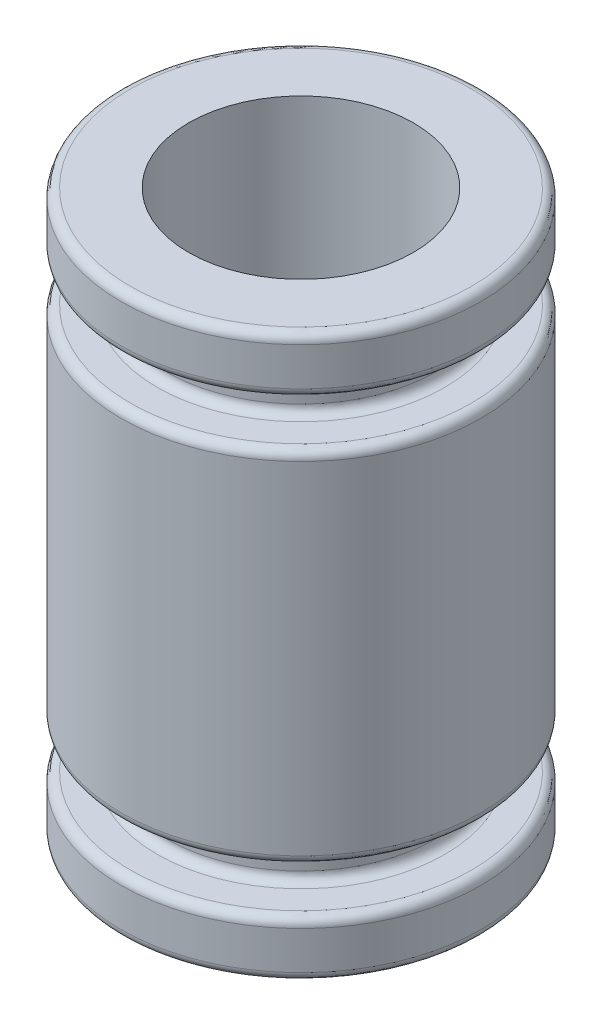
ISO-10303-21;
HEADER;
FILE_DESCRIPTION(('STEP AP214'),'2;1');
FILE_NAME('part.step','',(''),(''),'','','');
FILE_SCHEMA(('AUTOMOTIVE_DESIGN { 1 0 10303 214 1 1 1 1 }'));
ENDSEC;
DATA;
#1=APPLICATION_CONTEXT('core data for automotive mechanical design processes');
#2=APPLICATION_PROTOCOL_DEFINITION('international standard','automotive_design',2000,#1);
#3=PRODUCT_CONTEXT('',#1,'mechanical');
#4=PRODUCT('Part','Part','',(#3));
#5=PRODUCT_RELATED_PRODUCT_CATEGORY('part','',(#4));
#6=PRODUCT_DEFINITION_FORMATION('','',#4);
#7=PRODUCT_DEFINITION_CONTEXT('part definition',#1,'design');
#8=PRODUCT_DEFINITION('design','',#6,#7);
#9=PRODUCT_DEFINITION_SHAPE('','',#8);
#10=(LENGTH_UNIT() NAMED_UNIT(*) SI_UNIT(.MILLI.,.METRE.));
#11=(NAMED_UNIT(*) PLANE_ANGLE_UNIT() SI_UNIT($,.RADIAN.));
#12=(NAMED_UNIT(*) SI_UNIT($,.STERADIAN.) SOLID_ANGLE_UNIT());
#13=UNCERTAINTY_MEASURE_WITH_UNIT(LENGTH_MEASURE(1.E-05),#10,'distance_accuracy_value','');
#14=(GEOMETRIC_REPRESENTATION_CONTEXT(3) GLOBAL_UNCERTAINTY_ASSIGNED_CONTEXT((#13)) GLOBAL_UNIT_ASSIGNED_CONTEXT((#10,
#11,#12)) REPRESENTATION_CONTEXT('',''));
#15=CARTESIAN_POINT('',(0.,0.,0.));
#16=DIRECTION('',(0.,0.,1.));
#17=DIRECTION('',(1.,0.,0.));
#18=AXIS2_PLACEMENT_3D('',#15,#16,#17);
#19=CARTESIAN_POINT('',(0.,6.25,0.));
#20=DIRECTION('',(0.,-1.,0.));
#21=DIRECTION('',(1.,0.,0.));
#22=AXIS2_PLACEMENT_3D('',#19,#20,#21);
#23=PLANE('',#22);
#24=CARTESIAN_POINT('',(0.,6.25,0.));
#25=DIRECTION('',(0.,1.,0.));
#26=DIRECTION('',(-1.,0.,0.));
#27=AXIS2_PLACEMENT_3D('',#24,#25,#26);
#28=CIRCLE('',#27,2.5);
#29=CARTESIAN_POINT('',(-2.5,6.25,0.));
#30=VERTEX_POINT('',#29);
#31=EDGE_CURVE('E99',#30,#30,#28,.T.);
#32=ORIENTED_EDGE('',*,*,#31,.F.);
#33=EDGE_LOOP('',(#32));
#34=FACE_BOUND('',#33,.T.);
#35=CARTESIAN_POINT('',(0.,6.25,0.));
#36=DIRECTION('',(0.,-1.,0.));
#37=DIRECTION('',(1.,0.,0.));
#38=AXIS2_PLACEMENT_3D('',#35,#36,#37);
#39=CIRCLE('',#38,3.8);
#40=CARTESIAN_POINT('',(3.8,6.25,0.));
#41=VERTEX_POINT('',#40);
#42=EDGE_CURVE('E10',#41,#41,#39,.F.);
#43=ORIENTED_EDGE('',*,*,#42,.T.);
#44=EDGE_LOOP('',(#43));
#45=FACE_BOUND('',#44,.T.);
#46=ADVANCED_FACE('F30',(#34,#45),#23,.F.);
#47=CARTESIAN_POINT('',(0.,-6.25,0.));
#48=DIRECTION('',(0.,-1.,0.));
#49=DIRECTION('',(1.,0.,0.));
#50=AXIS2_PLACEMENT_3D('',#47,#48,#49);
#51=CYLINDRICAL_SURFACE('',#50,4.);
#52=CARTESIAN_POINT('',(0.,5.2,0.));
#53=DIRECTION('',(0.,1.,0.));
#54=DIRECTION('',(-1.,0.,0.));
#55=AXIS2_PLACEMENT_3D('',#52,#53,#54);
#56=CIRCLE('',#55,4.);
#57=CARTESIAN_POINT('',(-4.,5.2,0.));
#58=VERTEX_POINT('',#57);
#59=EDGE_CURVE('E37',#58,#58,#56,.T.);
#60=ORIENTED_EDGE('',*,*,#59,.T.);
#61=EDGE_LOOP('',(#60));
#62=FACE_BOUND('',#61,.T.);
#63=CARTESIAN_POINT('',(0.,6.05,0.));
#64=DIRECTION('',(0.,-1.,0.));
#65=DIRECTION('',(1.,0.,0.));
#66=AXIS2_PLACEMENT_3D('',#63,#64,#65);
#67=CIRCLE('',#66,4.);
#68=CARTESIAN_POINT('',(4.,6.05,0.));
#69=VERTEX_POINT('',#68);
#70=EDGE_CURVE('E41',#69,#69,#67,.T.);
#71=ORIENTED_EDGE('',*,*,#70,.T.);
#72=EDGE_LOOP('',(#71));
#73=FACE_BOUND('',#72,.T.);
#74=ADVANCED_FACE('F115',(#62,#73),#51,.T.);
#75=CARTESIAN_POINT('',(-4.,5.,0.));
#76=DIRECTION('',(0.,1.,0.));
#77=DIRECTION('',(-1.,0.,0.));
#78=AXIS2_PLACEMENT_3D('',#75,#76,#77);
#79=PLANE('',#78);
#80=CARTESIAN_POINT('',(0.,5.,0.));
#81=DIRECTION('',(0.,1.,0.));
#82=DIRECTION('',(-1.,0.,0.));
#83=AXIS2_PLACEMENT_3D('',#80,#81,#82);
#84=CIRCLE('',#83,3.2);
#85=CARTESIAN_POINT('',(-3.2,5.,0.));
#86=VERTEX_POINT('',#85);
#87=EDGE_CURVE('E53',#86,#86,#84,.T.);
#88=ORIENTED_EDGE('',*,*,#87,.T.);
#89=EDGE_LOOP('',(#88));
#90=FACE_BOUND('',#89,.T.);
#91=CARTESIAN_POINT('',(0.,5.,0.));
#92=DIRECTION('',(0.,1.,0.));
#93=DIRECTION('',(-1.,0.,0.));
#94=AXIS2_PLACEMENT_3D('',#91,#92,#93);
#95=CIRCLE('',#94,3.8);
#96=CARTESIAN_POINT('',(-3.8,5.,0.));
#97=VERTEX_POINT('',#96);
#98=EDGE_CURVE('E56',#97,#97,#95,.F.);
#99=ORIENTED_EDGE('',*,*,#98,.T.);
#100=EDGE_LOOP('',(#99));
#101=FACE_BOUND('',#100,.T.);
#102=ADVANCED_FACE('F120',(#90,#101),#79,.F.);
#103=CARTESIAN_POINT('',(0.,-6.25,0.));
#104=DIRECTION('',(0.,-1.,0.));
#105=DIRECTION('',(1.,0.,0.));
#106=AXIS2_PLACEMENT_3D('',#103,#104,#105);
#107=CYLINDRICAL_SURFACE('',#106,3.);
#108=CARTESIAN_POINT('',(0.,4.8,0.));
#109=DIRECTION('',(0.,1.,0.));
#110=DIRECTION('',(-1.,0.,0.));
#111=AXIS2_PLACEMENT_3D('',#108,#109,#110);
#112=CIRCLE('',#111,3.);
#113=CARTESIAN_POINT('',(-3.,4.8,0.));
#114=VERTEX_POINT('',#113);
#115=EDGE_CURVE('E59',#114,#114,#112,.F.);
#116=ORIENTED_EDGE('',*,*,#115,.T.);
#117=EDGE_LOOP('',(#116));
#118=FACE_BOUND('',#117,.T.);
#119=CARTESIAN_POINT('',(0.,4.2,0.));
#120=DIRECTION('',(0.,-1.,0.));
#121=DIRECTION('',(1.,0.,0.));
#122=AXIS2_PLACEMENT_3D('',#119,#120,#121);
#123=CIRCLE('',#122,3.);
#124=CARTESIAN_POINT('',(3.,4.2,0.));
#125=VERTEX_POINT('',#124);
#126=EDGE_CURVE('E62',#125,#125,#123,.F.);
#127=ORIENTED_EDGE('',*,*,#126,.T.);
#128=EDGE_LOOP('',(#127));
#129=FACE_BOUND('',#128,.T.);
#130=ADVANCED_FACE('F166',(#118,#129),#107,.T.);
#131=CARTESIAN_POINT('',(-3.,4.,0.));
#132=DIRECTION('',(0.,-1.,0.));
#133=DIRECTION('',(1.,0.,0.));
#134=AXIS2_PLACEMENT_3D('',#131,#132,#133);
#135=PLANE('',#134);
#136=CARTESIAN_POINT('',(0.,4.,0.));
#137=DIRECTION('',(0.,-1.,0.));
#138=DIRECTION('',(1.,0.,0.));
#139=AXIS2_PLACEMENT_3D('',#136,#137,#138);
#140=CIRCLE('',#139,3.2);
#141=CARTESIAN_POINT('',(3.2,4.,0.));
#142=VERTEX_POINT('',#141);
#143=EDGE_CURVE('E45',#142,#142,#140,.T.);
#144=ORIENTED_EDGE('',*,*,#143,.T.);
#145=EDGE_LOOP('',(#144));
#146=FACE_BOUND('',#145,.T.);
#147=CARTESIAN_POINT('',(0.,4.,0.));
#148=DIRECTION('',(0.,-1.,0.));
#149=DIRECTION('',(1.,0.,0.));
#150=AXIS2_PLACEMENT_3D('',#147,#148,#149);
#151=CIRCLE('',#150,3.8);
#152=CARTESIAN_POINT('',(3.8,4.,0.));
#153=VERTEX_POINT('',#152);
#154=EDGE_CURVE('E50',#153,#153,#151,.F.);
#155=ORIENTED_EDGE('',*,*,#154,.T.);
#156=EDGE_LOOP('',(#155));
#157=FACE_BOUND('',#156,.T.);
#158=ADVANCED_FACE('F171',(#146,#157),#135,.F.);
#159=CARTESIAN_POINT('',(0.,-6.25,0.));
#160=DIRECTION('',(0.,-1.,0.));
#161=DIRECTION('',(1.,0.,0.));
#162=AXIS2_PLACEMENT_3D('',#159,#160,#161);
#163=CYLINDRICAL_SURFACE('',#162,4.);
#164=CARTESIAN_POINT('',(0.,-3.8,0.));
#165=DIRECTION('',(0.,1.,0.));
#166=DIRECTION('',(-1.,0.,0.));
#167=AXIS2_PLACEMENT_3D('',#164,#165,#166);
#168=CIRCLE('',#167,4.);
#169=CARTESIAN_POINT('',(-4.,-3.8,0.));
#170=VERTEX_POINT('',#169);
#171=EDGE_CURVE('E65',#170,#170,#168,.T.);
#172=ORIENTED_EDGE('',*,*,#171,.T.);
#173=EDGE_LOOP('',(#172));
#174=FACE_BOUND('',#173,.T.);
#175=CARTESIAN_POINT('',(0.,3.8,0.));
#176=DIRECTION('',(0.,-1.,0.));
#177=DIRECTION('',(1.,0.,0.));
#178=AXIS2_PLACEMENT_3D('',#175,#176,#177);
#179=CIRCLE('',#178,4.);
#180=CARTESIAN_POINT('',(4.,3.8,0.));
#181=VERTEX_POINT('',#180);
#182=EDGE_CURVE('E68',#181,#181,#179,.T.);
#183=ORIENTED_EDGE('',*,*,#182,.T.);
#184=EDGE_LOOP('',(#183));
#185=FACE_BOUND('',#184,.T.);
#186=ADVANCED_FACE('F177',(#174,#185),#163,.T.);
#187=CARTESIAN_POINT('',(-3.,-4.,0.));
#188=DIRECTION('',(0.,1.,0.));
#189=DIRECTION('',(-1.,0.,0.));
#190=AXIS2_PLACEMENT_3D('',#187,#188,#189);
#191=PLANE('',#190);
#192=CARTESIAN_POINT('',(0.,-4.,0.));
#193=DIRECTION('',(0.,1.,0.));
#194=DIRECTION('',(-1.,0.,0.));
#195=AXIS2_PLACEMENT_3D('',#192,#193,#194);
#196=CIRCLE('',#195,3.2);
#197=CARTESIAN_POINT('',(-3.2,-4.,0.));
#198=VERTEX_POINT('',#197);
#199=EDGE_CURVE('E86',#198,#198,#196,.T.);
#200=ORIENTED_EDGE('',*,*,#199,.T.);
#201=EDGE_LOOP('',(#200));
#202=FACE_BOUND('',#201,.T.);
#203=CARTESIAN_POINT('',(0.,-4.,0.));
#204=DIRECTION('',(0.,1.,0.));
#205=DIRECTION('',(-1.,0.,0.));
#206=AXIS2_PLACEMENT_3D('',#203,#204,#205);
#207=CIRCLE('',#206,3.8);
#208=CARTESIAN_POINT('',(-3.8,-4.,0.));
#209=VERTEX_POINT('',#208);
#210=EDGE_CURVE('E89',#209,#209,#207,.F.);
#211=ORIENTED_EDGE('',*,*,#210,.T.);
#212=EDGE_LOOP('',(#211));
#213=FACE_BOUND('',#212,.T.);
#214=ADVANCED_FACE('F181',(#202,#213),#191,.F.);
#215=CARTESIAN_POINT('',(0.,-6.25,0.));
#216=DIRECTION('',(0.,-1.,0.));
#217=DIRECTION('',(1.,0.,0.));
#218=AXIS2_PLACEMENT_3D('',#215,#216,#217);
#219=CYLINDRICAL_SURFACE('',#218,3.);
#220=CARTESIAN_POINT('',(0.,-4.2,0.));
#221=DIRECTION('',(0.,1.,0.));
#222=DIRECTION('',(-1.,0.,0.));
#223=AXIS2_PLACEMENT_3D('',#220,#221,#222);
#224=CIRCLE('',#223,3.);
#225=CARTESIAN_POINT('',(-3.,-4.2,0.));
#226=VERTEX_POINT('',#225);
#227=EDGE_CURVE('E92',#226,#226,#224,.F.);
#228=ORIENTED_EDGE('',*,*,#227,.T.);
#229=EDGE_LOOP('',(#228));
#230=FACE_BOUND('',#229,.T.);
#231=CARTESIAN_POINT('',(0.,-4.8,0.));
#232=DIRECTION('',(0.,-1.,0.));
#233=DIRECTION('',(1.,0.,0.));
#234=AXIS2_PLACEMENT_3D('',#231,#232,#233);
#235=CIRCLE('',#234,3.);
#236=CARTESIAN_POINT('',(3.,-4.8,0.));
#237=VERTEX_POINT('',#236);
#238=EDGE_CURVE('E95',#237,#237,#235,.F.);
#239=ORIENTED_EDGE('',*,*,#238,.T.);
#240=EDGE_LOOP('',(#239));
#241=FACE_BOUND('',#240,.T.);
#242=ADVANCED_FACE('F185',(#230,#241),#219,.T.);
#243=CARTESIAN_POINT('',(-4.,-5.,0.));
#244=DIRECTION('',(0.,-1.,0.));
#245=DIRECTION('',(1.,0.,0.));
#246=AXIS2_PLACEMENT_3D('',#243,#244,#245);
#247=PLANE('',#246);
#248=CARTESIAN_POINT('',(0.,-5.,0.));
#249=DIRECTION('',(0.,-1.,0.));
#250=DIRECTION('',(1.,0.,0.));
#251=AXIS2_PLACEMENT_3D('',#248,#249,#250);
#252=CIRCLE('',#251,3.2);
#253=CARTESIAN_POINT('',(3.2,-5.,0.));
#254=VERTEX_POINT('',#253);
#255=EDGE_CURVE('E80',#254,#254,#252,.T.);
#256=ORIENTED_EDGE('',*,*,#255,.T.);
#257=EDGE_LOOP('',(#256));
#258=FACE_BOUND('',#257,.T.);
#259=CARTESIAN_POINT('',(0.,-5.,0.));
#260=DIRECTION('',(0.,-1.,0.));
#261=DIRECTION('',(1.,0.,0.));
#262=AXIS2_PLACEMENT_3D('',#259,#260,#261);
#263=CIRCLE('',#262,3.8);
#264=CARTESIAN_POINT('',(3.8,-5.,0.));
#265=VERTEX_POINT('',#264);
#266=EDGE_CURVE('E83',#265,#265,#263,.F.);
#267=ORIENTED_EDGE('',*,*,#266,.T.);
#268=EDGE_LOOP('',(#267));
#269=FACE_BOUND('',#268,.T.);
#270=ADVANCED_FACE('F189',(#258,#269),#247,.F.);
#271=CARTESIAN_POINT('',(0.,-6.25,0.));
#272=DIRECTION('',(0.,-1.,0.));
#273=DIRECTION('',(1.,0.,0.));
#274=AXIS2_PLACEMENT_3D('',#271,#272,#273);
#275=CYLINDRICAL_SURFACE('',#274,4.);
#276=CARTESIAN_POINT('',(0.,-6.05,0.));
#277=DIRECTION('',(0.,1.,0.));
#278=DIRECTION('',(-1.,0.,0.));
#279=AXIS2_PLACEMENT_3D('',#276,#277,#278);
#280=CIRCLE('',#279,4.);
#281=CARTESIAN_POINT('',(-4.,-6.05,0.));
#282=VERTEX_POINT('',#281);
#283=EDGE_CURVE('E71',#282,#282,#280,.T.);
#284=ORIENTED_EDGE('',*,*,#283,.T.);
#285=EDGE_LOOP('',(#284));
#286=FACE_BOUND('',#285,.T.);
#287=CARTESIAN_POINT('',(0.,-5.2,0.));
#288=DIRECTION('',(0.,-1.,0.));
#289=DIRECTION('',(1.,0.,0.));
#290=AXIS2_PLACEMENT_3D('',#287,#288,#289);
#291=CIRCLE('',#290,4.);
#292=CARTESIAN_POINT('',(4.,-5.2,0.));
#293=VERTEX_POINT('',#292);
#294=EDGE_CURVE('E74',#293,#293,#291,.T.);
#295=ORIENTED_EDGE('',*,*,#294,.T.);
#296=EDGE_LOOP('',(#295));
#297=FACE_BOUND('',#296,.T.);
#298=ADVANCED_FACE('F193',(#286,#297),#275,.T.);
#299=CARTESIAN_POINT('',(0.,-6.25,0.));
#300=DIRECTION('',(0.,1.,0.));
#301=DIRECTION('',(-1.,0.,0.));
#302=AXIS2_PLACEMENT_3D('',#299,#300,#301);
#303=PLANE('',#302);
#304=CARTESIAN_POINT('',(0.,-6.25,0.));
#305=DIRECTION('',(0.,1.,0.));
#306=DIRECTION('',(-1.,0.,0.));
#307=AXIS2_PLACEMENT_3D('',#304,#305,#306);
#308=CIRCLE('',#307,2.5);
#309=CARTESIAN_POINT('',(-2.5,-6.25,0.));
#310=VERTEX_POINT('',#309);
#311=EDGE_CURVE('E98',#310,#310,#308,.T.);
#312=ORIENTED_EDGE('',*,*,#311,.T.);
#313=EDGE_LOOP('',(#312));
#314=FACE_BOUND('',#313,.T.);
#315=CARTESIAN_POINT('',(0.,-6.25,0.));
#316=DIRECTION('',(0.,1.,0.));
#317=DIRECTION('',(-1.,0.,0.));
#318=AXIS2_PLACEMENT_3D('',#315,#316,#317);
#319=CIRCLE('',#318,3.8);
#320=CARTESIAN_POINT('',(-3.8,-6.25,0.));
#321=VERTEX_POINT('',#320);
#322=EDGE_CURVE('E77',#321,#321,#319,.F.);
#323=ORIENTED_EDGE('',*,*,#322,.T.);
#324=EDGE_LOOP('',(#323));
#325=FACE_BOUND('',#324,.T.);
#326=ADVANCED_FACE('F105',(#314,#325),#303,.F.);
#327=CARTESIAN_POINT('',(0.,-4.2,0.));
#328=DIRECTION('',(0.,1.,0.));
#329=DIRECTION('',(-1.,0.,0.));
#330=AXIS2_PLACEMENT_3D('',#327,#328,#329);
#331=TOROIDAL_SURFACE('',#330,3.2,0.2);
#332=ORIENTED_EDGE('',*,*,#199,.F.);
#333=EDGE_LOOP('',(#332));
#334=FACE_BOUND('',#333,.T.);
#335=ORIENTED_EDGE('',*,*,#227,.F.);
#336=EDGE_LOOP('',(#335));
#337=FACE_BOUND('',#336,.T.);
#338=ADVANCED_FACE('F124',(#334,#337),#331,.F.);
#339=CARTESIAN_POINT('',(0.,-4.8,0.));
#340=DIRECTION('',(0.,-1.,0.));
#341=DIRECTION('',(1.,0.,0.));
#342=AXIS2_PLACEMENT_3D('',#339,#340,#341);
#343=TOROIDAL_SURFACE('',#342,3.2,0.2);
#344=ORIENTED_EDGE('',*,*,#238,.F.);
#345=EDGE_LOOP('',(#344));
#346=FACE_BOUND('',#345,.T.);
#347=ORIENTED_EDGE('',*,*,#255,.F.);
#348=EDGE_LOOP('',(#347));
#349=FACE_BOUND('',#348,.T.);
#350=ADVANCED_FACE('F127',(#346,#349),#343,.F.);
#351=CARTESIAN_POINT('',(0.,-6.05,0.));
#352=DIRECTION('',(0.,1.,0.));
#353=DIRECTION('',(-1.,0.,0.));
#354=AXIS2_PLACEMENT_3D('',#351,#352,#353);
#355=TOROIDAL_SURFACE('',#354,3.8,0.2);
#356=ORIENTED_EDGE('',*,*,#283,.F.);
#357=EDGE_LOOP('',(#356));
#358=FACE_BOUND('',#357,.T.);
#359=ORIENTED_EDGE('',*,*,#322,.F.);
#360=EDGE_LOOP('',(#359));
#361=FACE_BOUND('',#360,.T.);
#362=ADVANCED_FACE('F131',(#358,#361),#355,.T.);
#363=CARTESIAN_POINT('',(0.,-5.2,0.));
#364=DIRECTION('',(0.,-1.,0.));
#365=DIRECTION('',(1.,0.,0.));
#366=AXIS2_PLACEMENT_3D('',#363,#364,#365);
#367=TOROIDAL_SURFACE('',#366,3.8,0.2);
#368=ORIENTED_EDGE('',*,*,#266,.F.);
#369=EDGE_LOOP('',(#368));
#370=FACE_BOUND('',#369,.T.);
#371=ORIENTED_EDGE('',*,*,#294,.F.);
#372=EDGE_LOOP('',(#371));
#373=FACE_BOUND('',#372,.T.);
#374=ADVANCED_FACE('F135',(#370,#373),#367,.T.);
#375=CARTESIAN_POINT('',(0.,-3.8,0.));
#376=DIRECTION('',(0.,1.,0.));
#377=DIRECTION('',(-1.,0.,0.));
#378=AXIS2_PLACEMENT_3D('',#375,#376,#377);
#379=TOROIDAL_SURFACE('',#378,3.8,0.2);
#380=ORIENTED_EDGE('',*,*,#171,.F.);
#381=EDGE_LOOP('',(#380));
#382=FACE_BOUND('',#381,.T.);
#383=ORIENTED_EDGE('',*,*,#210,.F.);
#384=EDGE_LOOP('',(#383));
#385=FACE_BOUND('',#384,.T.);
#386=ADVANCED_FACE('F139',(#382,#385),#379,.T.);
#387=CARTESIAN_POINT('',(0.,4.8,0.));
#388=DIRECTION('',(0.,1.,0.));
#389=DIRECTION('',(-1.,0.,0.));
#390=AXIS2_PLACEMENT_3D('',#387,#388,#389);
#391=TOROIDAL_SURFACE('',#390,3.2,0.2);
#392=ORIENTED_EDGE('',*,*,#87,.F.);
#393=EDGE_LOOP('',(#392));
#394=FACE_BOUND('',#393,.T.);
#395=ORIENTED_EDGE('',*,*,#115,.F.);
#396=EDGE_LOOP('',(#395));
#397=FACE_BOUND('',#396,.T.);
#398=ADVANCED_FACE('F143',(#394,#397),#391,.F.);
#399=CARTESIAN_POINT('',(0.,4.2,0.));
#400=DIRECTION('',(0.,-1.,0.));
#401=DIRECTION('',(1.,0.,0.));
#402=AXIS2_PLACEMENT_3D('',#399,#400,#401);
#403=TOROIDAL_SURFACE('',#402,3.2,0.2);
#404=ORIENTED_EDGE('',*,*,#126,.F.);
#405=EDGE_LOOP('',(#404));
#406=FACE_BOUND('',#405,.T.);
#407=ORIENTED_EDGE('',*,*,#143,.F.);
#408=EDGE_LOOP('',(#407));
#409=FACE_BOUND('',#408,.T.);
#410=ADVANCED_FACE('F147',(#406,#409),#403,.F.);
#411=CARTESIAN_POINT('',(0.,3.8,0.));
#412=DIRECTION('',(0.,-1.,0.));
#413=DIRECTION('',(1.,0.,0.));
#414=AXIS2_PLACEMENT_3D('',#411,#412,#413);
#415=TOROIDAL_SURFACE('',#414,3.8,0.2);
#416=ORIENTED_EDGE('',*,*,#154,.F.);
#417=EDGE_LOOP('',(#416));
#418=FACE_BOUND('',#417,.T.);
#419=ORIENTED_EDGE('',*,*,#182,.F.);
#420=EDGE_LOOP('',(#419));
#421=FACE_BOUND('',#420,.T.);
#422=ADVANCED_FACE('F151',(#418,#421),#415,.T.);
#423=CARTESIAN_POINT('',(0.,5.2,0.));
#424=DIRECTION('',(0.,1.,0.));
#425=DIRECTION('',(-1.,0.,0.));
#426=AXIS2_PLACEMENT_3D('',#423,#424,#425);
#427=TOROIDAL_SURFACE('',#426,3.8,0.2);
#428=ORIENTED_EDGE('',*,*,#59,.F.);
#429=EDGE_LOOP('',(#428));
#430=FACE_BOUND('',#429,.T.);
#431=ORIENTED_EDGE('',*,*,#98,.F.);
#432=EDGE_LOOP('',(#431));
#433=FACE_BOUND('',#432,.T.);
#434=ADVANCED_FACE('F154',(#430,#433),#427,.T.);
#435=CARTESIAN_POINT('',(0.,6.05,0.));
#436=DIRECTION('',(0.,-1.,0.));
#437=DIRECTION('',(1.,0.,0.));
#438=AXIS2_PLACEMENT_3D('',#435,#436,#437);
#439=TOROIDAL_SURFACE('',#438,3.8,0.2);
#440=ORIENTED_EDGE('',*,*,#42,.F.);
#441=EDGE_LOOP('',(#440));
#442=FACE_BOUND('',#441,.T.);
#443=ORIENTED_EDGE('',*,*,#70,.F.);
#444=EDGE_LOOP('',(#443));
#445=FACE_BOUND('',#444,.T.);
#446=ADVANCED_FACE('F32',(#442,#445),#439,.T.);
#447=CARTESIAN_POINT('',(0.,-6.25,0.));
#448=DIRECTION('',(0.,1.,0.));
#449=DIRECTION('',(-1.,0.,0.));
#450=AXIS2_PLACEMENT_3D('',#447,#448,#449);
#451=CYLINDRICAL_SURFACE('',#450,2.5);
#452=ORIENTED_EDGE('',*,*,#311,.F.);
#453=EDGE_LOOP('',(#452));
#454=FACE_BOUND('',#453,.T.);
#455=ORIENTED_EDGE('',*,*,#31,.T.);
#456=EDGE_LOOP('',(#455));
#457=FACE_BOUND('',#456,.T.);
#458=ADVANCED_FACE('F108',(#454,#457),#451,.F.);
#459=CLOSED_SHELL('',(#46,#74,#102,#130,#158,#186,#214,#242,#270,#298,#326,#338,#350,#362,#374,
#386,#398,#410,#422,#434,#446,#458));
#460=MANIFOLD_SOLID_BREP('B2',#459);
#461=ADVANCED_BREP_SHAPE_REPRESENTATION('',(#18,#460),#14);
#462=SHAPE_DEFINITION_REPRESENTATION(#9,#461);
ENDSEC;
END-ISO-10303-21;
